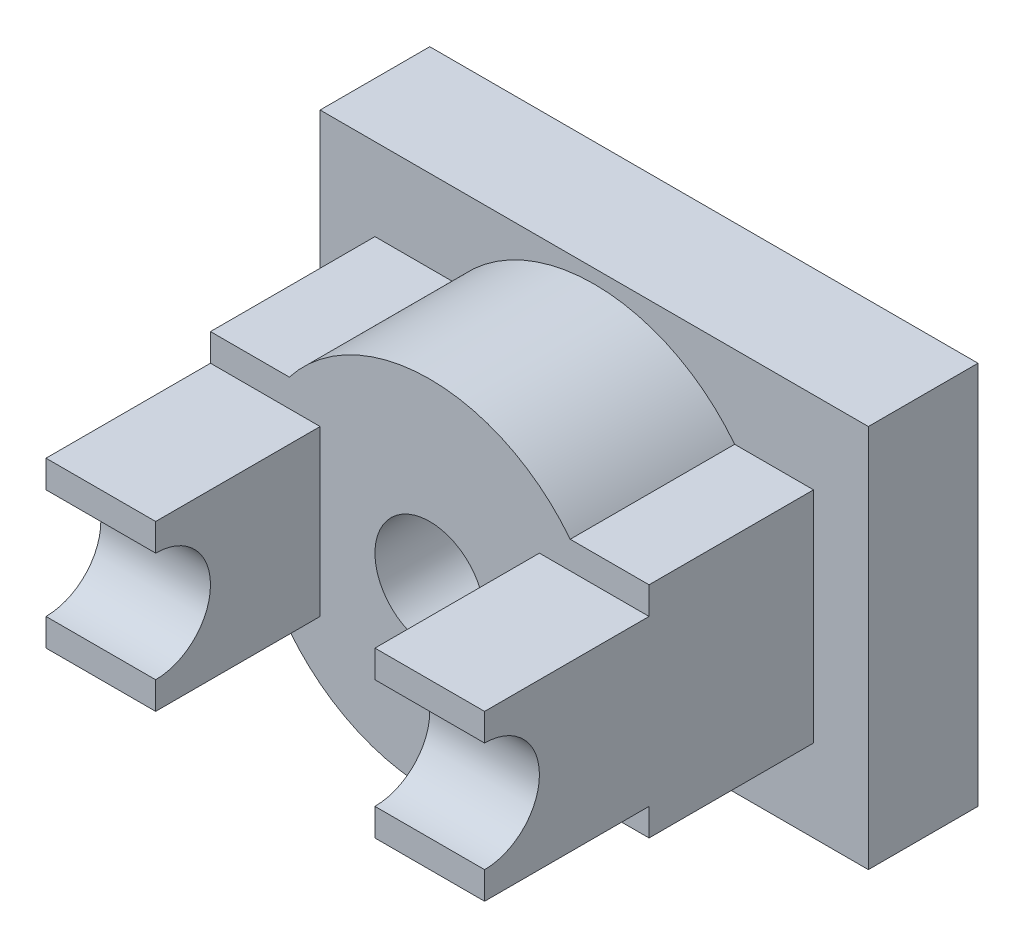
ISO-10303-21;
HEADER;
FILE_DESCRIPTION(('STEP AP214'),'2;1');
FILE_NAME('part.step','',(''),(''),'','','');
FILE_SCHEMA(('AUTOMOTIVE_DESIGN { 1 0 10303 214 1 1 1 1 }'));
ENDSEC;
DATA;
#1=APPLICATION_CONTEXT('core data for automotive mechanical design processes');
#2=APPLICATION_PROTOCOL_DEFINITION('international standard','automotive_design',2000,#1);
#3=PRODUCT_CONTEXT('',#1,'mechanical');
#4=PRODUCT('Part','Part','',(#3));
#5=PRODUCT_RELATED_PRODUCT_CATEGORY('part','',(#4));
#6=PRODUCT_DEFINITION_FORMATION('','',#4);
#7=PRODUCT_DEFINITION_CONTEXT('part definition',#1,'design');
#8=PRODUCT_DEFINITION('design','',#6,#7);
#9=PRODUCT_DEFINITION_SHAPE('','',#8);
#10=(LENGTH_UNIT() NAMED_UNIT(*) SI_UNIT(.MILLI.,.METRE.));
#11=(NAMED_UNIT(*) PLANE_ANGLE_UNIT() SI_UNIT($,.RADIAN.));
#12=(NAMED_UNIT(*) SI_UNIT($,.STERADIAN.) SOLID_ANGLE_UNIT());
#13=UNCERTAINTY_MEASURE_WITH_UNIT(LENGTH_MEASURE(1.E-05),#10,'distance_accuracy_value','');
#14=(GEOMETRIC_REPRESENTATION_CONTEXT(3) GLOBAL_UNCERTAINTY_ASSIGNED_CONTEXT((#13)) GLOBAL_UNIT_ASSIGNED_CONTEXT((#10,
#11,#12)) REPRESENTATION_CONTEXT('',''));
#15=CARTESIAN_POINT('',(0.,0.,0.));
#16=DIRECTION('',(0.,0.,1.));
#17=DIRECTION('',(1.,0.,0.));
#18=AXIS2_PLACEMENT_3D('',#15,#16,#17);
#19=CARTESIAN_POINT('',(0.,0.,80.));
#20=DIRECTION('',(0.,0.,1.));
#21=DIRECTION('',(1.,0.,0.));
#22=AXIS2_PLACEMENT_3D('',#19,#20,#21);
#23=PLANE('',#22);
#24=DIRECTION('',(-1.,0.,0.));
#25=VECTOR('',#24,1.);
#26=CARTESIAN_POINT('',(50.,9.99999999999999,80.));
#27=LINE('',#26,#25);
#28=CARTESIAN_POINT('',(40.,9.99999999999999,80.));
#29=VERTEX_POINT('',#28);
#30=CARTESIAN_POINT('',(20.,9.99999999999999,80.));
#31=VERTEX_POINT('',#30);
#32=EDGE_CURVE('E205',#29,#31,#27,.T.);
#33=ORIENTED_EDGE('',*,*,#32,.F.);
#34=DIRECTION('',(0.,1.,0.));
#35=VECTOR('',#34,1.);
#36=CARTESIAN_POINT('',(40.,15.,80.));
#37=LINE('',#36,#35);
#38=CARTESIAN_POINT('',(40.,15.,80.));
#39=VERTEX_POINT('',#38);
#40=EDGE_CURVE('E250',#29,#39,#37,.T.);
#41=ORIENTED_EDGE('',*,*,#40,.T.);
#42=DIRECTION('',(-1.,0.,0.));
#43=VECTOR('',#42,1.);
#44=CARTESIAN_POINT('',(20.,15.,80.));
#45=LINE('',#44,#43);
#46=CARTESIAN_POINT('',(20.,15.,80.));
#47=VERTEX_POINT('',#46);
#48=EDGE_CURVE('E254',#39,#47,#45,.T.);
#49=ORIENTED_EDGE('',*,*,#48,.T.);
#50=DIRECTION('',(0.,-1.,0.));
#51=VECTOR('',#50,1.);
#52=CARTESIAN_POINT('',(20.,15.,80.));
#53=LINE('',#52,#51);
#54=EDGE_CURVE('E244',#47,#31,#53,.T.);
#55=ORIENTED_EDGE('',*,*,#54,.T.);
#56=EDGE_LOOP('',(#33,#41,#49,#55));
#57=FACE_BOUND('',#56,.T.);
#58=ADVANCED_FACE('F33',(#57),#23,.T.);
#59=CARTESIAN_POINT('',(0.,0.,80.));
#60=DIRECTION('',(0.,0.,1.));
#61=DIRECTION('',(1.,0.,0.));
#62=AXIS2_PLACEMENT_3D('',#59,#60,#61);
#63=PLANE('',#62);
#64=DIRECTION('',(-1.,0.,0.));
#65=VECTOR('',#64,1.);
#66=CARTESIAN_POINT('',(50.,9.99999999999999,80.));
#67=LINE('',#66,#65);
#68=CARTESIAN_POINT('',(-20.,9.99999999999999,80.));
#69=VERTEX_POINT('',#68);
#70=CARTESIAN_POINT('',(-40.,9.99999999999999,80.));
#71=VERTEX_POINT('',#70);
#72=EDGE_CURVE('E11',#69,#71,#67,.T.);
#73=ORIENTED_EDGE('',*,*,#72,.F.);
#74=DIRECTION('',(0.,1.,0.));
#75=VECTOR('',#74,1.);
#76=CARTESIAN_POINT('',(-20.,15.,80.));
#77=LINE('',#76,#75);
#78=CARTESIAN_POINT('',(-20.,15.,80.));
#79=VERTEX_POINT('',#78);
#80=EDGE_CURVE('E213',#69,#79,#77,.T.);
#81=ORIENTED_EDGE('',*,*,#80,.T.);
#82=DIRECTION('',(-1.,0.,0.));
#83=VECTOR('',#82,1.);
#84=CARTESIAN_POINT('',(-40.,15.,80.));
#85=LINE('',#84,#83);
#86=CARTESIAN_POINT('',(-40.,15.,80.));
#87=VERTEX_POINT('',#86);
#88=EDGE_CURVE('E209',#79,#87,#85,.T.);
#89=ORIENTED_EDGE('',*,*,#88,.T.);
#90=DIRECTION('',(0.,-1.,0.));
#91=VECTOR('',#90,1.);
#92=CARTESIAN_POINT('',(-40.,15.,80.));
#93=LINE('',#92,#91);
#94=EDGE_CURVE('E202',#87,#71,#93,.T.);
#95=ORIENTED_EDGE('',*,*,#94,.T.);
#96=EDGE_LOOP('',(#73,#81,#89,#95));
#97=FACE_BOUND('',#96,.T.);
#98=ADVANCED_FACE('F207',(#97),#63,.T.);
#99=CARTESIAN_POINT('',(0.,0.,50.));
#100=DIRECTION('',(0.,0.,1.));
#101=DIRECTION('',(1.,0.,0.));
#102=AXIS2_PLACEMENT_3D('',#99,#100,#101);
#103=PLANE('',#102);
#104=CARTESIAN_POINT('',(0.,0.,50.));
#105=DIRECTION('',(0.,0.,1.));
#106=DIRECTION('',(1.,0.,0.));
#107=AXIS2_PLACEMENT_3D('',#104,#105,#106);
#108=CIRCLE('',#107,10.);
#109=CARTESIAN_POINT('',(10.,0.,50.));
#110=VERTEX_POINT('',#109);
#111=EDGE_CURVE('E276',#110,#110,#108,.T.);
#112=ORIENTED_EDGE('',*,*,#111,.F.);
#113=EDGE_LOOP('',(#112));
#114=FACE_BOUND('',#113,.T.);
#115=DIRECTION('',(0.,1.,0.));
#116=VECTOR('',#115,1.);
#117=CARTESIAN_POINT('',(-20.,15.,50.));
#118=LINE('',#117,#116);
#119=CARTESIAN_POINT('',(-20.,-15.,50.));
#120=VERTEX_POINT('',#119);
#121=CARTESIAN_POINT('',(-20.,15.,50.));
#122=VERTEX_POINT('',#121);
#123=EDGE_CURVE('E228',#120,#122,#118,.T.);
#124=ORIENTED_EDGE('',*,*,#123,.F.);
#125=DIRECTION('',(1.,0.,0.));
#126=VECTOR('',#125,1.);
#127=CARTESIAN_POINT('',(-40.,-15.,50.));
#128=LINE('',#127,#126);
#129=CARTESIAN_POINT('',(-40.,-15.,50.));
#130=VERTEX_POINT('',#129);
#131=EDGE_CURVE('E225',#130,#120,#128,.T.);
#132=ORIENTED_EDGE('',*,*,#131,.F.);
#133=DIRECTION('',(0.,-1.,0.));
#134=VECTOR('',#133,1.);
#135=CARTESIAN_POINT('',(-40.,20.,50.));
#136=LINE('',#135,#134);
#137=CARTESIAN_POINT('',(-40.,-20.,50.));
#138=VERTEX_POINT('',#137);
#139=EDGE_CURVE('E286',#130,#138,#136,.T.);
#140=ORIENTED_EDGE('',*,*,#139,.T.);
#141=DIRECTION('',(1.,0.,0.));
#142=VECTOR('',#141,1.);
#143=CARTESIAN_POINT('',(-40.,-20.,50.));
#144=LINE('',#143,#142);
#145=CARTESIAN_POINT('',(-25.617376914899,-20.,50.));
#146=VERTEX_POINT('',#145);
#147=EDGE_CURVE('E289',#138,#146,#144,.T.);
#148=ORIENTED_EDGE('',*,*,#147,.T.);
#149=CARTESIAN_POINT('',(0.,0.,50.));
#150=DIRECTION('',(0.,0.,1.));
#151=DIRECTION('',(1.,0.,0.));
#152=AXIS2_PLACEMENT_3D('',#149,#150,#151);
#153=CIRCLE('',#152,32.5);
#154=CARTESIAN_POINT('',(25.617376914899,-20.,50.));
#155=VERTEX_POINT('',#154);
#156=EDGE_CURVE('E291',#146,#155,#153,.T.);
#157=ORIENTED_EDGE('',*,*,#156,.T.);
#158=DIRECTION('',(1.,0.,0.));
#159=VECTOR('',#158,1.);
#160=CARTESIAN_POINT('',(25.617376914899,-20.,50.));
#161=LINE('',#160,#159);
#162=CARTESIAN_POINT('',(40.,-20.,50.));
#163=VERTEX_POINT('',#162);
#164=EDGE_CURVE('E293',#155,#163,#161,.T.);
#165=ORIENTED_EDGE('',*,*,#164,.T.);
#166=DIRECTION('',(0.,1.,0.));
#167=VECTOR('',#166,1.);
#168=CARTESIAN_POINT('',(40.,20.,50.));
#169=LINE('',#168,#167);
#170=CARTESIAN_POINT('',(40.,-15.,50.));
#171=VERTEX_POINT('',#170);
#172=EDGE_CURVE('E296',#163,#171,#169,.T.);
#173=ORIENTED_EDGE('',*,*,#172,.T.);
#174=DIRECTION('',(1.,0.,0.));
#175=VECTOR('',#174,1.);
#176=CARTESIAN_POINT('',(20.,-15.,50.));
#177=LINE('',#176,#175);
#178=CARTESIAN_POINT('',(20.,-15.,50.));
#179=VERTEX_POINT('',#178);
#180=EDGE_CURVE('E259',#179,#171,#177,.T.);
#181=ORIENTED_EDGE('',*,*,#180,.F.);
#182=DIRECTION('',(0.,-1.,0.));
#183=VECTOR('',#182,1.);
#184=CARTESIAN_POINT('',(20.,15.,50.));
#185=LINE('',#184,#183);
#186=CARTESIAN_POINT('',(20.,15.,50.));
#187=VERTEX_POINT('',#186);
#188=EDGE_CURVE('E243',#187,#179,#185,.T.);
#189=ORIENTED_EDGE('',*,*,#188,.F.);
#190=DIRECTION('',(-1.,0.,0.));
#191=VECTOR('',#190,1.);
#192=CARTESIAN_POINT('',(20.,15.,50.));
#193=LINE('',#192,#191);
#194=CARTESIAN_POINT('',(40.,15.,50.));
#195=VERTEX_POINT('',#194);
#196=EDGE_CURVE('E262',#195,#187,#193,.T.);
#197=ORIENTED_EDGE('',*,*,#196,.F.);
#198=CARTESIAN_POINT('',(40.,20.,50.));
#199=VERTEX_POINT('',#198);
#200=EDGE_CURVE('E295',#195,#199,#169,.T.);
#201=ORIENTED_EDGE('',*,*,#200,.T.);
#202=DIRECTION('',(-1.,0.,0.));
#203=VECTOR('',#202,1.);
#204=CARTESIAN_POINT('',(25.617376914899,20.,50.));
#205=LINE('',#204,#203);
#206=CARTESIAN_POINT('',(25.617376914899,20.,50.));
#207=VERTEX_POINT('',#206);
#208=EDGE_CURVE('E298',#199,#207,#205,.T.);
#209=ORIENTED_EDGE('',*,*,#208,.T.);
#210=CARTESIAN_POINT('',(0.,0.,50.));
#211=DIRECTION('',(0.,0.,1.));
#212=DIRECTION('',(1.,0.,0.));
#213=AXIS2_PLACEMENT_3D('',#210,#211,#212);
#214=CIRCLE('',#213,32.5);
#215=CARTESIAN_POINT('',(-25.617376914899,20.,50.));
#216=VERTEX_POINT('',#215);
#217=EDGE_CURVE('E280',#207,#216,#214,.T.);
#218=ORIENTED_EDGE('',*,*,#217,.T.);
#219=DIRECTION('',(-1.,0.,0.));
#220=VECTOR('',#219,1.);
#221=CARTESIAN_POINT('',(-40.,20.,50.));
#222=LINE('',#221,#220);
#223=CARTESIAN_POINT('',(-40.,20.,50.));
#224=VERTEX_POINT('',#223);
#225=EDGE_CURVE('E283',#216,#224,#222,.T.);
#226=ORIENTED_EDGE('',*,*,#225,.T.);
#227=CARTESIAN_POINT('',(-40.,15.,50.));
#228=VERTEX_POINT('',#227);
#229=EDGE_CURVE('E287',#224,#228,#136,.T.);
#230=ORIENTED_EDGE('',*,*,#229,.T.);
#231=DIRECTION('',(-1.,0.,0.));
#232=VECTOR('',#231,1.);
#233=CARTESIAN_POINT('',(-40.,15.,50.));
#234=LINE('',#233,#232);
#235=EDGE_CURVE('E215',#122,#228,#234,.T.);
#236=ORIENTED_EDGE('',*,*,#235,.F.);
#237=EDGE_LOOP('',(#124,#132,#140,#148,#157,#165,#173,#181,#189,#197,#201,#209,#218,#226,#230,#236));
#238=FACE_BOUND('',#237,.T.);
#239=ADVANCED_FACE('F389',(#114,#238),#103,.T.);
#240=CARTESIAN_POINT('',(50.,35.,20.));
#241=DIRECTION('',(-1.,0.,0.));
#242=DIRECTION('',(0.,-1.,0.));
#243=AXIS2_PLACEMENT_3D('',#240,#241,#242);
#244=PLANE('',#243);
#245=DIRECTION('',(0.,1.,0.));
#246=VECTOR('',#245,1.);
#247=CARTESIAN_POINT('',(50.,35.,0.));
#248=LINE('',#247,#246);
#249=CARTESIAN_POINT('',(50.,-35.,0.));
#250=VERTEX_POINT('',#249);
#251=CARTESIAN_POINT('',(50.,35.,0.));
#252=VERTEX_POINT('',#251);
#253=EDGE_CURVE('E338',#250,#252,#248,.T.);
#254=ORIENTED_EDGE('',*,*,#253,.T.);
#255=DIRECTION('',(0.,0.,-1.));
#256=VECTOR('',#255,1.);
#257=CARTESIAN_POINT('',(50.,35.,20.));
#258=LINE('',#257,#256);
#259=CARTESIAN_POINT('',(50.,35.,20.));
#260=VERTEX_POINT('',#259);
#261=EDGE_CURVE('E365',#260,#252,#258,.T.);
#262=ORIENTED_EDGE('',*,*,#261,.F.);
#263=DIRECTION('',(0.,1.,0.));
#264=VECTOR('',#263,1.);
#265=CARTESIAN_POINT('',(50.,35.,20.));
#266=LINE('',#265,#264);
#267=CARTESIAN_POINT('',(50.,-35.,20.));
#268=VERTEX_POINT('',#267);
#269=EDGE_CURVE('E339',#268,#260,#266,.T.);
#270=ORIENTED_EDGE('',*,*,#269,.F.);
#271=DIRECTION('',(0.,0.,-1.));
#272=VECTOR('',#271,1.);
#273=CARTESIAN_POINT('',(50.,-35.,20.));
#274=LINE('',#273,#272);
#275=EDGE_CURVE('E349',#268,#250,#274,.T.);
#276=ORIENTED_EDGE('',*,*,#275,.T.);
#277=EDGE_LOOP('',(#254,#262,#270,#276));
#278=FACE_BOUND('',#277,.T.);
#279=ADVANCED_FACE('F35',(#278),#244,.F.);
#280=CARTESIAN_POINT('',(-50.,35.,20.));
#281=DIRECTION('',(0.,-1.,0.));
#282=DIRECTION('',(0.,0.,-1.));
#283=AXIS2_PLACEMENT_3D('',#280,#281,#282);
#284=PLANE('',#283);
#285=DIRECTION('',(-1.,0.,0.));
#286=VECTOR('',#285,1.);
#287=CARTESIAN_POINT('',(-50.,35.,0.));
#288=LINE('',#287,#286);
#289=CARTESIAN_POINT('',(-50.,35.,0.));
#290=VERTEX_POINT('',#289);
#291=EDGE_CURVE('E352',#252,#290,#288,.T.);
#292=ORIENTED_EDGE('',*,*,#291,.T.);
#293=DIRECTION('',(0.,0.,-1.));
#294=VECTOR('',#293,1.);
#295=CARTESIAN_POINT('',(-50.,35.,20.));
#296=LINE('',#295,#294);
#297=CARTESIAN_POINT('',(-50.,35.,20.));
#298=VERTEX_POINT('',#297);
#299=EDGE_CURVE('E362',#298,#290,#296,.T.);
#300=ORIENTED_EDGE('',*,*,#299,.F.);
#301=DIRECTION('',(-1.,0.,0.));
#302=VECTOR('',#301,1.);
#303=CARTESIAN_POINT('',(-50.,35.,20.));
#304=LINE('',#303,#302);
#305=EDGE_CURVE('E342',#260,#298,#304,.T.);
#306=ORIENTED_EDGE('',*,*,#305,.F.);
#307=ORIENTED_EDGE('',*,*,#261,.T.);
#308=EDGE_LOOP('',(#292,#300,#306,#307));
#309=FACE_BOUND('',#308,.T.);
#310=ADVANCED_FACE('F663',(#309),#284,.F.);
#311=CARTESIAN_POINT('',(-50.,35.,20.));
#312=DIRECTION('',(1.,0.,0.));
#313=DIRECTION('',(0.,1.,0.));
#314=AXIS2_PLACEMENT_3D('',#311,#312,#313);
#315=PLANE('',#314);
#316=DIRECTION('',(0.,-1.,0.));
#317=VECTOR('',#316,1.);
#318=CARTESIAN_POINT('',(-50.,35.,0.));
#319=LINE('',#318,#317);
#320=CARTESIAN_POINT('',(-50.,-35.,0.));
#321=VERTEX_POINT('',#320);
#322=EDGE_CURVE('E354',#290,#321,#319,.T.);
#323=ORIENTED_EDGE('',*,*,#322,.T.);
#324=DIRECTION('',(0.,0.,-1.));
#325=VECTOR('',#324,1.);
#326=CARTESIAN_POINT('',(-50.,-35.,20.));
#327=LINE('',#326,#325);
#328=CARTESIAN_POINT('',(-50.,-35.,20.));
#329=VERTEX_POINT('',#328);
#330=EDGE_CURVE('E359',#329,#321,#327,.T.);
#331=ORIENTED_EDGE('',*,*,#330,.F.);
#332=DIRECTION('',(0.,-1.,0.));
#333=VECTOR('',#332,1.);
#334=CARTESIAN_POINT('',(-50.,35.,20.));
#335=LINE('',#334,#333);
#336=EDGE_CURVE('E345',#298,#329,#335,.T.);
#337=ORIENTED_EDGE('',*,*,#336,.F.);
#338=ORIENTED_EDGE('',*,*,#299,.T.);
#339=EDGE_LOOP('',(#323,#331,#337,#338));
#340=FACE_BOUND('',#339,.T.);
#341=ADVANCED_FACE('F653',(#340),#315,.F.);
#342=CARTESIAN_POINT('',(-50.,-35.,20.));
#343=DIRECTION('',(0.,1.,0.));
#344=DIRECTION('',(0.,0.,1.));
#345=AXIS2_PLACEMENT_3D('',#342,#343,#344);
#346=PLANE('',#345);
#347=DIRECTION('',(1.,0.,0.));
#348=VECTOR('',#347,1.);
#349=CARTESIAN_POINT('',(-50.,-35.,0.));
#350=LINE('',#349,#348);
#351=EDGE_CURVE('E343',#321,#250,#350,.T.);
#352=ORIENTED_EDGE('',*,*,#351,.T.);
#353=ORIENTED_EDGE('',*,*,#275,.F.);
#354=DIRECTION('',(1.,0.,0.));
#355=VECTOR('',#354,1.);
#356=CARTESIAN_POINT('',(-50.,-35.,20.));
#357=LINE('',#356,#355);
#358=EDGE_CURVE('E347',#329,#268,#357,.T.);
#359=ORIENTED_EDGE('',*,*,#358,.F.);
#360=ORIENTED_EDGE('',*,*,#330,.T.);
#361=EDGE_LOOP('',(#352,#353,#359,#360));
#362=FACE_BOUND('',#361,.T.);
#363=ADVANCED_FACE('F639',(#362),#346,.F.);
#364=CARTESIAN_POINT('',(0.,0.,20.));
#365=DIRECTION('',(0.,0.,1.));
#366=DIRECTION('',(1.,0.,0.));
#367=AXIS2_PLACEMENT_3D('',#364,#365,#366);
#368=PLANE('',#367);
#369=DIRECTION('',(-1.,0.,0.));
#370=VECTOR('',#369,1.);
#371=CARTESIAN_POINT('',(-40.,20.,20.));
#372=LINE('',#371,#370);
#373=CARTESIAN_POINT('',(-25.617376914899,20.,20.));
#374=VERTEX_POINT('',#373);
#375=CARTESIAN_POINT('',(-40.,20.,20.));
#376=VERTEX_POINT('',#375);
#377=EDGE_CURVE('E303',#374,#376,#372,.T.);
#378=ORIENTED_EDGE('',*,*,#377,.F.);
#379=CARTESIAN_POINT('',(0.,0.,20.));
#380=DIRECTION('',(0.,0.,1.));
#381=DIRECTION('',(1.,0.,0.));
#382=AXIS2_PLACEMENT_3D('',#379,#380,#381);
#383=CIRCLE('',#382,32.5);
#384=CARTESIAN_POINT('',(25.617376914899,20.,20.));
#385=VERTEX_POINT('',#384);
#386=EDGE_CURVE('E279',#385,#374,#383,.T.);
#387=ORIENTED_EDGE('',*,*,#386,.F.);
#388=DIRECTION('',(-1.,0.,0.));
#389=VECTOR('',#388,1.);
#390=CARTESIAN_POINT('',(25.617376914899,20.,20.));
#391=LINE('',#390,#389);
#392=CARTESIAN_POINT('',(40.,20.,20.));
#393=VERTEX_POINT('',#392);
#394=EDGE_CURVE('E284',#393,#385,#391,.T.);
#395=ORIENTED_EDGE('',*,*,#394,.F.);
#396=DIRECTION('',(0.,1.,0.));
#397=VECTOR('',#396,1.);
#398=CARTESIAN_POINT('',(40.,20.,20.));
#399=LINE('',#398,#397);
#400=CARTESIAN_POINT('',(40.,-20.,20.));
#401=VERTEX_POINT('',#400);
#402=EDGE_CURVE('E313',#401,#393,#399,.T.);
#403=ORIENTED_EDGE('',*,*,#402,.F.);
#404=DIRECTION('',(1.,0.,0.));
#405=VECTOR('',#404,1.);
#406=CARTESIAN_POINT('',(25.617376914899,-20.,20.));
#407=LINE('',#406,#405);
#408=CARTESIAN_POINT('',(25.617376914899,-20.,20.));
#409=VERTEX_POINT('',#408);
#410=EDGE_CURVE('E311',#409,#401,#407,.T.);
#411=ORIENTED_EDGE('',*,*,#410,.F.);
#412=CARTESIAN_POINT('',(0.,0.,20.));
#413=DIRECTION('',(0.,0.,1.));
#414=DIRECTION('',(1.,0.,0.));
#415=AXIS2_PLACEMENT_3D('',#412,#413,#414);
#416=CIRCLE('',#415,32.5);
#417=CARTESIAN_POINT('',(-25.617376914899,-20.,20.));
#418=VERTEX_POINT('',#417);
#419=EDGE_CURVE('E309',#418,#409,#416,.T.);
#420=ORIENTED_EDGE('',*,*,#419,.F.);
#421=DIRECTION('',(1.,0.,0.));
#422=VECTOR('',#421,1.);
#423=CARTESIAN_POINT('',(-40.,-20.,20.));
#424=LINE('',#423,#422);
#425=CARTESIAN_POINT('',(-40.,-20.,20.));
#426=VERTEX_POINT('',#425);
#427=EDGE_CURVE('E307',#426,#418,#424,.T.);
#428=ORIENTED_EDGE('',*,*,#427,.F.);
#429=DIRECTION('',(0.,-1.,0.));
#430=VECTOR('',#429,1.);
#431=CARTESIAN_POINT('',(-40.,20.,20.));
#432=LINE('',#431,#430);
#433=EDGE_CURVE('E305',#376,#426,#432,.T.);
#434=ORIENTED_EDGE('',*,*,#433,.F.);
#435=EDGE_LOOP('',(#378,#387,#395,#403,#411,#420,#428,#434));
#436=FACE_BOUND('',#435,.T.);
#437=ORIENTED_EDGE('',*,*,#269,.T.);
#438=ORIENTED_EDGE('',*,*,#305,.T.);
#439=ORIENTED_EDGE('',*,*,#336,.T.);
#440=ORIENTED_EDGE('',*,*,#358,.T.);
#441=EDGE_LOOP('',(#437,#438,#439,#440));
#442=FACE_BOUND('',#441,.T.);
#443=ADVANCED_FACE('F397',(#436,#442),#368,.T.);
#444=CARTESIAN_POINT('',(0.,0.,0.));
#445=DIRECTION('',(0.,0.,1.));
#446=DIRECTION('',(1.,0.,0.));
#447=AXIS2_PLACEMENT_3D('',#444,#445,#446);
#448=PLANE('',#447);
#449=ORIENTED_EDGE('',*,*,#253,.F.);
#450=ORIENTED_EDGE('',*,*,#351,.F.);
#451=ORIENTED_EDGE('',*,*,#322,.F.);
#452=ORIENTED_EDGE('',*,*,#291,.F.);
#453=EDGE_LOOP('',(#449,#450,#451,#452));
#454=FACE_BOUND('',#453,.T.);
#455=ADVANCED_FACE('F446',(#454),#448,.F.);
#456=CARTESIAN_POINT('',(0.,0.,50.));
#457=DIRECTION('',(0.,0.,-1.));
#458=DIRECTION('',(-1.,0.,0.));
#459=AXIS2_PLACEMENT_3D('',#456,#457,#458);
#460=CYLINDRICAL_SURFACE('',#459,32.5);
#461=ORIENTED_EDGE('',*,*,#386,.T.);
#462=DIRECTION('',(0.,0.,-1.));
#463=VECTOR('',#462,1.);
#464=CARTESIAN_POINT('',(-25.617376914899,20.,50.));
#465=LINE('',#464,#463);
#466=EDGE_CURVE('E336',#216,#374,#465,.T.);
#467=ORIENTED_EDGE('',*,*,#466,.F.);
#468=ORIENTED_EDGE('',*,*,#217,.F.);
#469=DIRECTION('',(0.,0.,-1.));
#470=VECTOR('',#469,1.);
#471=CARTESIAN_POINT('',(25.617376914899,20.,50.));
#472=LINE('',#471,#470);
#473=EDGE_CURVE('E300',#207,#385,#472,.T.);
#474=ORIENTED_EDGE('',*,*,#473,.T.);
#475=EDGE_LOOP('',(#461,#467,#468,#474));
#476=FACE_BOUND('',#475,.T.);
#477=ADVANCED_FACE('F444',(#476),#460,.T.);
#478=CARTESIAN_POINT('',(-40.,20.,50.));
#479=DIRECTION('',(0.,-1.,0.));
#480=DIRECTION('',(0.,0.,-1.));
#481=AXIS2_PLACEMENT_3D('',#478,#479,#480);
#482=PLANE('',#481);
#483=ORIENTED_EDGE('',*,*,#377,.T.);
#484=DIRECTION('',(0.,0.,-1.));
#485=VECTOR('',#484,1.);
#486=CARTESIAN_POINT('',(-40.,20.,50.));
#487=LINE('',#486,#485);
#488=EDGE_CURVE('E333',#224,#376,#487,.T.);
#489=ORIENTED_EDGE('',*,*,#488,.F.);
#490=ORIENTED_EDGE('',*,*,#225,.F.);
#491=ORIENTED_EDGE('',*,*,#466,.T.);
#492=EDGE_LOOP('',(#483,#489,#490,#491));
#493=FACE_BOUND('',#492,.T.);
#494=ADVANCED_FACE('F393',(#493),#482,.F.);
#495=CARTESIAN_POINT('',(-40.,20.,50.));
#496=DIRECTION('',(1.,0.,0.));
#497=DIRECTION('',(0.,0.,-1.));
#498=AXIS2_PLACEMENT_3D('',#495,#496,#497);
#499=PLANE('',#498);
#500=CARTESIAN_POINT('',(-40.,-9.99999999999999,80.));
#501=VERTEX_POINT('',#500);
#502=CARTESIAN_POINT('',(-40.,-15.,80.));
#503=VERTEX_POINT('',#502);
#504=EDGE_CURVE('E204',#501,#503,#93,.T.);
#505=ORIENTED_EDGE('',*,*,#504,.F.);
#506=CARTESIAN_POINT('',(-40.,0.,80.));
#507=DIRECTION('',(-1.,0.,0.));
#508=DIRECTION('',(0.,0.,1.));
#509=AXIS2_PLACEMENT_3D('',#506,#507,#508);
#510=CIRCLE('',#509,9.99999999999999);
#511=EDGE_CURVE('E55',#71,#501,#510,.T.);
#512=ORIENTED_EDGE('',*,*,#511,.F.);
#513=ORIENTED_EDGE('',*,*,#94,.F.);
#514=DIRECTION('',(0.,0.,-1.));
#515=VECTOR('',#514,1.);
#516=CARTESIAN_POINT('',(-40.,15.,80.));
#517=LINE('',#516,#515);
#518=EDGE_CURVE('E224',#87,#228,#517,.T.);
#519=ORIENTED_EDGE('',*,*,#518,.T.);
#520=ORIENTED_EDGE('',*,*,#229,.F.);
#521=ORIENTED_EDGE('',*,*,#488,.T.);
#522=ORIENTED_EDGE('',*,*,#433,.T.);
#523=DIRECTION('',(0.,0.,-1.));
#524=VECTOR('',#523,1.);
#525=CARTESIAN_POINT('',(-40.,-20.,50.));
#526=LINE('',#525,#524);
#527=EDGE_CURVE('E330',#138,#426,#526,.T.);
#528=ORIENTED_EDGE('',*,*,#527,.F.);
#529=ORIENTED_EDGE('',*,*,#139,.F.);
#530=DIRECTION('',(0.,0.,-1.));
#531=VECTOR('',#530,1.);
#532=CARTESIAN_POINT('',(-40.,-15.,80.));
#533=LINE('',#532,#531);
#534=EDGE_CURVE('E240',#503,#130,#533,.T.);
#535=ORIENTED_EDGE('',*,*,#534,.F.);
#536=EDGE_LOOP('',(#505,#512,#513,#519,#520,#521,#522,#528,#529,#535));
#537=FACE_BOUND('',#536,.T.);
#538=ADVANCED_FACE('F200',(#537),#499,.F.);
#539=CARTESIAN_POINT('',(-40.,-20.,50.));
#540=DIRECTION('',(0.,1.,0.));
#541=DIRECTION('',(0.,0.,1.));
#542=AXIS2_PLACEMENT_3D('',#539,#540,#541);
#543=PLANE('',#542);
#544=ORIENTED_EDGE('',*,*,#427,.T.);
#545=DIRECTION('',(0.,0.,-1.));
#546=VECTOR('',#545,1.);
#547=CARTESIAN_POINT('',(-25.617376914899,-20.,50.));
#548=LINE('',#547,#546);
#549=EDGE_CURVE('E327',#146,#418,#548,.T.);
#550=ORIENTED_EDGE('',*,*,#549,.F.);
#551=ORIENTED_EDGE('',*,*,#147,.F.);
#552=ORIENTED_EDGE('',*,*,#527,.T.);
#553=EDGE_LOOP('',(#544,#550,#551,#552));
#554=FACE_BOUND('',#553,.T.);
#555=ADVANCED_FACE('F405',(#554),#543,.F.);
#556=CARTESIAN_POINT('',(0.,0.,50.));
#557=DIRECTION('',(0.,0.,-1.));
#558=DIRECTION('',(-1.,0.,0.));
#559=AXIS2_PLACEMENT_3D('',#556,#557,#558);
#560=CYLINDRICAL_SURFACE('',#559,32.5);
#561=ORIENTED_EDGE('',*,*,#419,.T.);
#562=DIRECTION('',(0.,0.,-1.));
#563=VECTOR('',#562,1.);
#564=CARTESIAN_POINT('',(25.617376914899,-20.,50.));
#565=LINE('',#564,#563);
#566=EDGE_CURVE('E324',#155,#409,#565,.T.);
#567=ORIENTED_EDGE('',*,*,#566,.F.);
#568=ORIENTED_EDGE('',*,*,#156,.F.);
#569=ORIENTED_EDGE('',*,*,#549,.T.);
#570=EDGE_LOOP('',(#561,#567,#568,#569));
#571=FACE_BOUND('',#570,.T.);
#572=ADVANCED_FACE('F412',(#571),#560,.T.);
#573=CARTESIAN_POINT('',(25.617376914899,-20.,50.));
#574=DIRECTION('',(0.,1.,0.));
#575=DIRECTION('',(0.,0.,1.));
#576=AXIS2_PLACEMENT_3D('',#573,#574,#575);
#577=PLANE('',#576);
#578=ORIENTED_EDGE('',*,*,#410,.T.);
#579=DIRECTION('',(0.,0.,-1.));
#580=VECTOR('',#579,1.);
#581=CARTESIAN_POINT('',(40.,-20.,50.));
#582=LINE('',#581,#580);
#583=EDGE_CURVE('E321',#163,#401,#582,.T.);
#584=ORIENTED_EDGE('',*,*,#583,.F.);
#585=ORIENTED_EDGE('',*,*,#164,.F.);
#586=ORIENTED_EDGE('',*,*,#566,.T.);
#587=EDGE_LOOP('',(#578,#584,#585,#586));
#588=FACE_BOUND('',#587,.T.);
#589=ADVANCED_FACE('F415',(#588),#577,.F.);
#590=CARTESIAN_POINT('',(40.,20.,50.));
#591=DIRECTION('',(-1.,0.,0.));
#592=DIRECTION('',(0.,0.,1.));
#593=AXIS2_PLACEMENT_3D('',#590,#591,#592);
#594=PLANE('',#593);
#595=ORIENTED_EDGE('',*,*,#40,.F.);
#596=CARTESIAN_POINT('',(40.,0.,80.));
#597=DIRECTION('',(-1.,0.,0.));
#598=DIRECTION('',(0.,0.,1.));
#599=AXIS2_PLACEMENT_3D('',#596,#597,#598);
#600=CIRCLE('',#599,9.99999999999999);
#601=CARTESIAN_POINT('',(40.,-9.99999999999999,80.));
#602=VERTEX_POINT('',#601);
#603=EDGE_CURVE('E217',#29,#602,#600,.T.);
#604=ORIENTED_EDGE('',*,*,#603,.T.);
#605=CARTESIAN_POINT('',(40.,-15.,80.));
#606=VERTEX_POINT('',#605);
#607=EDGE_CURVE('E251',#606,#602,#37,.T.);
#608=ORIENTED_EDGE('',*,*,#607,.F.);
#609=DIRECTION('',(0.,0.,-1.));
#610=VECTOR('',#609,1.);
#611=CARTESIAN_POINT('',(40.,-15.,80.));
#612=LINE('',#611,#610);
#613=EDGE_CURVE('E270',#606,#171,#612,.T.);
#614=ORIENTED_EDGE('',*,*,#613,.T.);
#615=ORIENTED_EDGE('',*,*,#172,.F.);
#616=ORIENTED_EDGE('',*,*,#583,.T.);
#617=ORIENTED_EDGE('',*,*,#402,.T.);
#618=DIRECTION('',(0.,0.,-1.));
#619=VECTOR('',#618,1.);
#620=CARTESIAN_POINT('',(40.,20.,50.));
#621=LINE('',#620,#619);
#622=EDGE_CURVE('E319',#199,#393,#621,.T.);
#623=ORIENTED_EDGE('',*,*,#622,.F.);
#624=ORIENTED_EDGE('',*,*,#200,.F.);
#625=DIRECTION('',(0.,0.,-1.));
#626=VECTOR('',#625,1.);
#627=CARTESIAN_POINT('',(40.,15.,80.));
#628=LINE('',#627,#626);
#629=EDGE_CURVE('E267',#39,#195,#628,.T.);
#630=ORIENTED_EDGE('',*,*,#629,.F.);
#631=EDGE_LOOP('',(#595,#604,#608,#614,#615,#616,#617,#623,#624,#630));
#632=FACE_BOUND('',#631,.T.);
#633=ADVANCED_FACE('F420',(#632),#594,.F.);
#634=CARTESIAN_POINT('',(25.617376914899,20.,50.));
#635=DIRECTION('',(0.,-1.,0.));
#636=DIRECTION('',(0.,0.,-1.));
#637=AXIS2_PLACEMENT_3D('',#634,#635,#636);
#638=PLANE('',#637);
#639=ORIENTED_EDGE('',*,*,#394,.T.);
#640=ORIENTED_EDGE('',*,*,#473,.F.);
#641=ORIENTED_EDGE('',*,*,#208,.F.);
#642=ORIENTED_EDGE('',*,*,#622,.T.);
#643=EDGE_LOOP('',(#639,#640,#641,#642));
#644=FACE_BOUND('',#643,.T.);
#645=ADVANCED_FACE('F442',(#644),#638,.F.);
#646=CARTESIAN_POINT('',(0.,0.,50.));
#647=DIRECTION('',(0.,0.,-1.));
#648=DIRECTION('',(-1.,0.,0.));
#649=AXIS2_PLACEMENT_3D('',#646,#647,#648);
#650=CYLINDRICAL_SURFACE('',#649,10.);
#651=ORIENTED_EDGE('',*,*,#111,.T.);
#652=EDGE_LOOP('',(#651));
#653=FACE_BOUND('',#652,.T.);
#654=CARTESIAN_POINT('',(0.,0.,20.));
#655=DIRECTION('',(0.,0.,1.));
#656=DIRECTION('',(1.,0.,0.));
#657=AXIS2_PLACEMENT_3D('',#654,#655,#656);
#658=CIRCLE('',#657,10.);
#659=CARTESIAN_POINT('',(10.,0.,20.));
#660=VERTEX_POINT('',#659);
#661=EDGE_CURVE('E368',#660,#660,#658,.F.);
#662=ORIENTED_EDGE('',*,*,#661,.T.);
#663=EDGE_LOOP('',(#662));
#664=FACE_BOUND('',#663,.T.);
#665=ADVANCED_FACE('F587',(#653,#664),#650,.F.);
#666=ORIENTED_EDGE('',*,*,#661,.F.);
#667=EDGE_LOOP('',(#666));
#668=FACE_BOUND('',#667,.T.);
#669=ADVANCED_FACE('F553',(#668),#368,.T.);
#670=CARTESIAN_POINT('',(20.,15.,80.));
#671=DIRECTION('',(1.,0.,0.));
#672=DIRECTION('',(0.,1.,0.));
#673=AXIS2_PLACEMENT_3D('',#670,#671,#672);
#674=PLANE('',#673);
#675=CARTESIAN_POINT('',(20.,-9.99999999999999,80.));
#676=VERTEX_POINT('',#675);
#677=CARTESIAN_POINT('',(20.,-15.,80.));
#678=VERTEX_POINT('',#677);
#679=EDGE_CURVE('E248',#676,#678,#53,.T.);
#680=ORIENTED_EDGE('',*,*,#679,.F.);
#681=CARTESIAN_POINT('',(20.,0.,80.));
#682=DIRECTION('',(1.,0.,0.));
#683=DIRECTION('',(0.,1.,0.));
#684=AXIS2_PLACEMENT_3D('',#681,#682,#683);
#685=CIRCLE('',#684,9.99999999999999);
#686=EDGE_CURVE('E48',#676,#31,#685,.T.);
#687=ORIENTED_EDGE('',*,*,#686,.T.);
#688=ORIENTED_EDGE('',*,*,#54,.F.);
#689=DIRECTION('',(0.,0.,-1.));
#690=VECTOR('',#689,1.);
#691=CARTESIAN_POINT('',(20.,15.,80.));
#692=LINE('',#691,#690);
#693=EDGE_CURVE('E256',#47,#187,#692,.T.);
#694=ORIENTED_EDGE('',*,*,#693,.T.);
#695=ORIENTED_EDGE('',*,*,#188,.T.);
#696=DIRECTION('',(0.,0.,-1.));
#697=VECTOR('',#696,1.);
#698=CARTESIAN_POINT('',(20.,-15.,80.));
#699=LINE('',#698,#697);
#700=EDGE_CURVE('E273',#678,#179,#699,.T.);
#701=ORIENTED_EDGE('',*,*,#700,.F.);
#702=EDGE_LOOP('',(#680,#687,#688,#694,#695,#701));
#703=FACE_BOUND('',#702,.T.);
#704=ADVANCED_FACE('F429',(#703),#674,.F.);
#705=CARTESIAN_POINT('',(20.,-15.,80.));
#706=DIRECTION('',(0.,1.,0.));
#707=DIRECTION('',(0.,0.,1.));
#708=AXIS2_PLACEMENT_3D('',#705,#706,#707);
#709=PLANE('',#708);
#710=ORIENTED_EDGE('',*,*,#180,.T.);
#711=ORIENTED_EDGE('',*,*,#613,.F.);
#712=DIRECTION('',(1.,0.,0.));
#713=VECTOR('',#712,1.);
#714=CARTESIAN_POINT('',(20.,-15.,80.));
#715=LINE('',#714,#713);
#716=EDGE_CURVE('E247',#678,#606,#715,.T.);
#717=ORIENTED_EDGE('',*,*,#716,.F.);
#718=ORIENTED_EDGE('',*,*,#700,.T.);
#719=EDGE_LOOP('',(#710,#711,#717,#718));
#720=FACE_BOUND('',#719,.T.);
#721=ADVANCED_FACE('F424',(#720),#709,.F.);
#722=CARTESIAN_POINT('',(20.,15.,80.));
#723=DIRECTION('',(0.,-1.,0.));
#724=DIRECTION('',(0.,0.,-1.));
#725=AXIS2_PLACEMENT_3D('',#722,#723,#724);
#726=PLANE('',#725);
#727=ORIENTED_EDGE('',*,*,#196,.T.);
#728=ORIENTED_EDGE('',*,*,#693,.F.);
#729=ORIENTED_EDGE('',*,*,#48,.F.);
#730=ORIENTED_EDGE('',*,*,#629,.T.);
#731=EDGE_LOOP('',(#727,#728,#729,#730));
#732=FACE_BOUND('',#731,.T.);
#733=ADVANCED_FACE('F434',(#732),#726,.F.);
#734=DIRECTION('',(-1.,0.,0.));
#735=VECTOR('',#734,1.);
#736=CARTESIAN_POINT('',(50.,-9.99999999999999,80.));
#737=LINE('',#736,#735);
#738=EDGE_CURVE('E375',#602,#676,#737,.T.);
#739=ORIENTED_EDGE('',*,*,#738,.T.);
#740=ORIENTED_EDGE('',*,*,#679,.T.);
#741=ORIENTED_EDGE('',*,*,#716,.T.);
#742=ORIENTED_EDGE('',*,*,#607,.T.);
#743=EDGE_LOOP('',(#739,#740,#741,#742));
#744=FACE_BOUND('',#743,.T.);
#745=ADVANCED_FACE('F459',(#744),#23,.T.);
#746=CARTESIAN_POINT('',(-40.,-15.,80.));
#747=DIRECTION('',(0.,1.,0.));
#748=DIRECTION('',(0.,0.,1.));
#749=AXIS2_PLACEMENT_3D('',#746,#747,#748);
#750=PLANE('',#749);
#751=ORIENTED_EDGE('',*,*,#131,.T.);
#752=DIRECTION('',(0.,0.,-1.));
#753=VECTOR('',#752,1.);
#754=CARTESIAN_POINT('',(-20.,-15.,80.));
#755=LINE('',#754,#753);
#756=CARTESIAN_POINT('',(-20.,-15.,80.));
#757=VERTEX_POINT('',#756);
#758=EDGE_CURVE('E237',#757,#120,#755,.T.);
#759=ORIENTED_EDGE('',*,*,#758,.F.);
#760=DIRECTION('',(1.,0.,0.));
#761=VECTOR('',#760,1.);
#762=CARTESIAN_POINT('',(-40.,-15.,80.));
#763=LINE('',#762,#761);
#764=EDGE_CURVE('E211',#503,#757,#763,.T.);
#765=ORIENTED_EDGE('',*,*,#764,.F.);
#766=ORIENTED_EDGE('',*,*,#534,.T.);
#767=EDGE_LOOP('',(#751,#759,#765,#766));
#768=FACE_BOUND('',#767,.T.);
#769=ADVANCED_FACE('F381',(#768),#750,.F.);
#770=CARTESIAN_POINT('',(-20.,15.,80.));
#771=DIRECTION('',(-1.,0.,0.));
#772=DIRECTION('',(0.,0.,1.));
#773=AXIS2_PLACEMENT_3D('',#770,#771,#772);
#774=PLANE('',#773);
#775=ORIENTED_EDGE('',*,*,#80,.F.);
#776=CARTESIAN_POINT('',(-20.,0.,80.));
#777=DIRECTION('',(-1.,0.,0.));
#778=DIRECTION('',(0.,0.,1.));
#779=AXIS2_PLACEMENT_3D('',#776,#777,#778);
#780=CIRCLE('',#779,9.99999999999999);
#781=CARTESIAN_POINT('',(-20.,-9.99999999999999,80.));
#782=VERTEX_POINT('',#781);
#783=EDGE_CURVE('E193',#69,#782,#780,.T.);
#784=ORIENTED_EDGE('',*,*,#783,.T.);
#785=EDGE_CURVE('E220',#757,#782,#77,.T.);
#786=ORIENTED_EDGE('',*,*,#785,.F.);
#787=ORIENTED_EDGE('',*,*,#758,.T.);
#788=ORIENTED_EDGE('',*,*,#123,.T.);
#789=DIRECTION('',(0.,0.,-1.));
#790=VECTOR('',#789,1.);
#791=CARTESIAN_POINT('',(-20.,15.,80.));
#792=LINE('',#791,#790);
#793=EDGE_CURVE('E234',#79,#122,#792,.T.);
#794=ORIENTED_EDGE('',*,*,#793,.F.);
#795=EDGE_LOOP('',(#775,#784,#786,#787,#788,#794));
#796=FACE_BOUND('',#795,.T.);
#797=ADVANCED_FACE('F373',(#796),#774,.F.);
#798=CARTESIAN_POINT('',(-40.,15.,80.));
#799=DIRECTION('',(0.,-1.,0.));
#800=DIRECTION('',(0.,0.,-1.));
#801=AXIS2_PLACEMENT_3D('',#798,#799,#800);
#802=PLANE('',#801);
#803=ORIENTED_EDGE('',*,*,#235,.T.);
#804=ORIENTED_EDGE('',*,*,#518,.F.);
#805=ORIENTED_EDGE('',*,*,#88,.F.);
#806=ORIENTED_EDGE('',*,*,#793,.T.);
#807=EDGE_LOOP('',(#803,#804,#805,#806));
#808=FACE_BOUND('',#807,.T.);
#809=ADVANCED_FACE('F385',(#808),#802,.F.);
#810=DIRECTION('',(-1.,0.,0.));
#811=VECTOR('',#810,1.);
#812=CARTESIAN_POINT('',(50.,-9.99999999999999,80.));
#813=LINE('',#812,#811);
#814=EDGE_CURVE('E41',#501,#782,#813,.F.);
#815=ORIENTED_EDGE('',*,*,#814,.F.);
#816=ORIENTED_EDGE('',*,*,#504,.T.);
#817=ORIENTED_EDGE('',*,*,#764,.T.);
#818=ORIENTED_EDGE('',*,*,#785,.T.);
#819=EDGE_LOOP('',(#815,#816,#817,#818));
#820=FACE_BOUND('',#819,.T.);
#821=ADVANCED_FACE('F377',(#820),#63,.T.);
#822=CARTESIAN_POINT('',(50.,0.,80.));
#823=DIRECTION('',(-1.,0.,0.));
#824=DIRECTION('',(0.,0.,1.));
#825=AXIS2_PLACEMENT_3D('',#822,#823,#824);
#826=CYLINDRICAL_SURFACE('',#825,9.99999999999999);
#827=ORIENTED_EDGE('',*,*,#72,.T.);
#828=ORIENTED_EDGE('',*,*,#511,.T.);
#829=ORIENTED_EDGE('',*,*,#814,.T.);
#830=ORIENTED_EDGE('',*,*,#783,.F.);
#831=EDGE_LOOP('',(#827,#828,#829,#830));
#832=FACE_BOUND('',#831,.T.);
#833=ADVANCED_FACE('F191',(#832),#826,.F.);
#834=ORIENTED_EDGE('',*,*,#32,.T.);
#835=ORIENTED_EDGE('',*,*,#686,.F.);
#836=ORIENTED_EDGE('',*,*,#738,.F.);
#837=ORIENTED_EDGE('',*,*,#603,.F.);
#838=EDGE_LOOP('',(#834,#835,#836,#837));
#839=FACE_BOUND('',#838,.T.);
#840=ADVANCED_FACE('F475',(#839),#826,.F.);
#841=CLOSED_SHELL('',(#58,#98,#239,#279,#310,#341,#363,#443,#455,#477,#494,#538,#555,#572,#589,
#633,#645,#665,#669,#704,#721,#733,#745,#769,#797,#809,#821,#833,#840));
#842=MANIFOLD_SOLID_BREP('B2',#841);
#843=ADVANCED_BREP_SHAPE_REPRESENTATION('',(#18,#842),#14);
#844=SHAPE_DEFINITION_REPRESENTATION(#9,#843);
ENDSEC;
END-ISO-10303-21;
